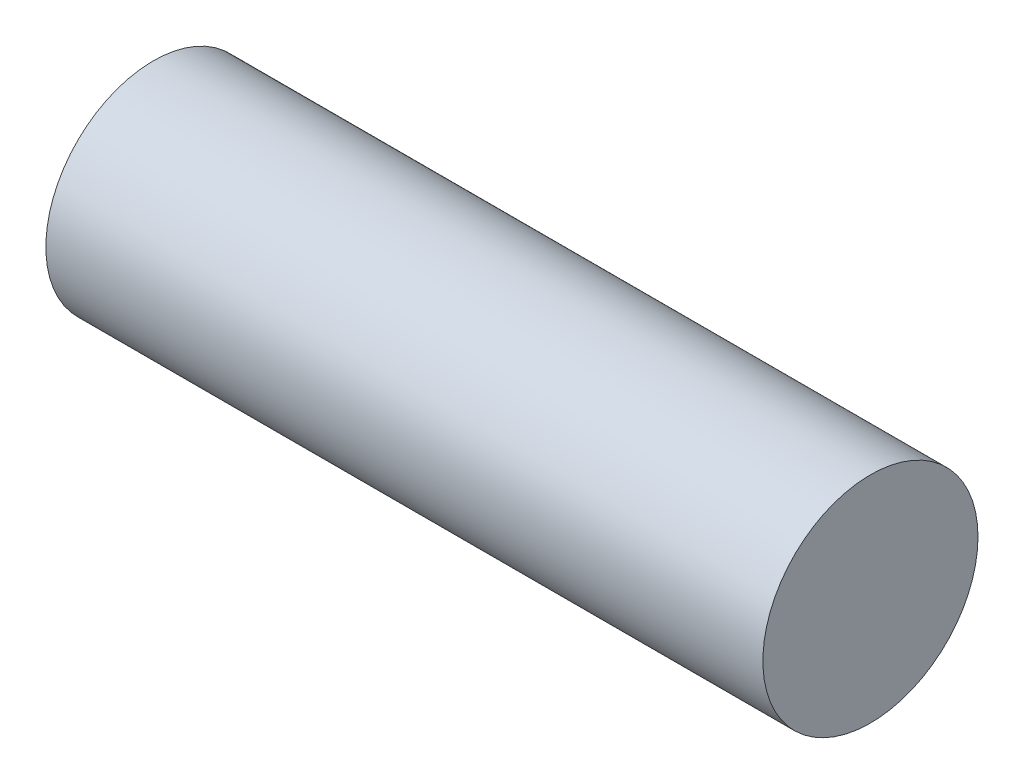
ISO-10303-21;
HEADER;
FILE_DESCRIPTION(('STEP AP214'),'2;1');
FILE_NAME('part.step','',(''),(''),'','','');
FILE_SCHEMA(('AUTOMOTIVE_DESIGN { 1 0 10303 214 1 1 1 1 }'));
ENDSEC;
DATA;
#1=APPLICATION_CONTEXT('core data for automotive mechanical design processes');
#2=APPLICATION_PROTOCOL_DEFINITION('international standard','automotive_design',2000,#1);
#3=PRODUCT_CONTEXT('',#1,'mechanical');
#4=PRODUCT('Part','Part','',(#3));
#5=PRODUCT_RELATED_PRODUCT_CATEGORY('part','',(#4));
#6=PRODUCT_DEFINITION_FORMATION('','',#4);
#7=PRODUCT_DEFINITION_CONTEXT('part definition',#1,'design');
#8=PRODUCT_DEFINITION('design','',#6,#7);
#9=PRODUCT_DEFINITION_SHAPE('','',#8);
#10=(LENGTH_UNIT() NAMED_UNIT(*) SI_UNIT(.MILLI.,.METRE.));
#11=(NAMED_UNIT(*) PLANE_ANGLE_UNIT() SI_UNIT($,.RADIAN.));
#12=(NAMED_UNIT(*) SI_UNIT($,.STERADIAN.) SOLID_ANGLE_UNIT());
#13=UNCERTAINTY_MEASURE_WITH_UNIT(LENGTH_MEASURE(1.E-05),#10,'distance_accuracy_value','');
#14=(GEOMETRIC_REPRESENTATION_CONTEXT(3) GLOBAL_UNCERTAINTY_ASSIGNED_CONTEXT((#13)) GLOBAL_UNIT_ASSIGNED_CONTEXT((#10,
#11,#12)) REPRESENTATION_CONTEXT('',''));
#15=CARTESIAN_POINT('',(0.,0.,0.));
#16=DIRECTION('',(0.,0.,1.));
#17=DIRECTION('',(1.,0.,0.));
#18=AXIS2_PLACEMENT_3D('',#15,#16,#17);
#19=CARTESIAN_POINT('',(31.75,0.,0.));
#20=DIRECTION('',(-1.,0.,0.));
#21=DIRECTION('',(0.,0.,1.));
#22=AXIS2_PLACEMENT_3D('',#19,#20,#21);
#23=CYLINDRICAL_SURFACE('',#22,4.7625);
#24=CARTESIAN_POINT('',(31.75,0.,0.));
#25=DIRECTION('',(1.,0.,0.));
#26=DIRECTION('',(0.,0.,-1.));
#27=AXIS2_PLACEMENT_3D('',#24,#25,#26);
#28=CIRCLE('',#27,4.7625);
#29=CARTESIAN_POINT('',(31.75,0.,-4.7625));
#30=VERTEX_POINT('',#29);
#31=EDGE_CURVE('E10',#30,#30,#28,.T.);
#32=ORIENTED_EDGE('',*,*,#31,.F.);
#33=EDGE_LOOP('',(#32));
#34=FACE_BOUND('',#33,.T.);
#35=CARTESIAN_POINT('',(0.,0.,0.));
#36=DIRECTION('',(1.,0.,0.));
#37=DIRECTION('',(0.,0.,-1.));
#38=AXIS2_PLACEMENT_3D('',#35,#36,#37);
#39=CIRCLE('',#38,4.7625);
#40=CARTESIAN_POINT('',(0.,0.,-4.7625));
#41=VERTEX_POINT('',#40);
#42=EDGE_CURVE('E34',#41,#41,#39,.T.);
#43=ORIENTED_EDGE('',*,*,#42,.T.);
#44=EDGE_LOOP('',(#43));
#45=FACE_BOUND('',#44,.T.);
#46=ADVANCED_FACE('F31',(#34,#45),#23,.T.);
#47=CARTESIAN_POINT('',(31.75,0.,0.));
#48=DIRECTION('',(1.,0.,0.));
#49=DIRECTION('',(0.,0.,-1.));
#50=AXIS2_PLACEMENT_3D('',#47,#48,#49);
#51=PLANE('',#50);
#52=ORIENTED_EDGE('',*,*,#31,.T.);
#53=EDGE_LOOP('',(#52));
#54=FACE_BOUND('',#53,.T.);
#55=ADVANCED_FACE('F46',(#54),#51,.T.);
#56=CARTESIAN_POINT('',(0.,0.,0.));
#57=DIRECTION('',(1.,0.,0.));
#58=DIRECTION('',(0.,0.,-1.));
#59=AXIS2_PLACEMENT_3D('',#56,#57,#58);
#60=PLANE('',#59);
#61=ORIENTED_EDGE('',*,*,#42,.F.);
#62=EDGE_LOOP('',(#61));
#63=FACE_BOUND('',#62,.T.);
#64=ADVANCED_FACE('F44',(#63),#60,.F.);
#65=CLOSED_SHELL('',(#46,#55,#64));
#66=MANIFOLD_SOLID_BREP('B2',#65);
#67=ADVANCED_BREP_SHAPE_REPRESENTATION('',(#18,#66),#14);
#68=SHAPE_DEFINITION_REPRESENTATION(#9,#67);
ENDSEC;
END-ISO-10303-21;
